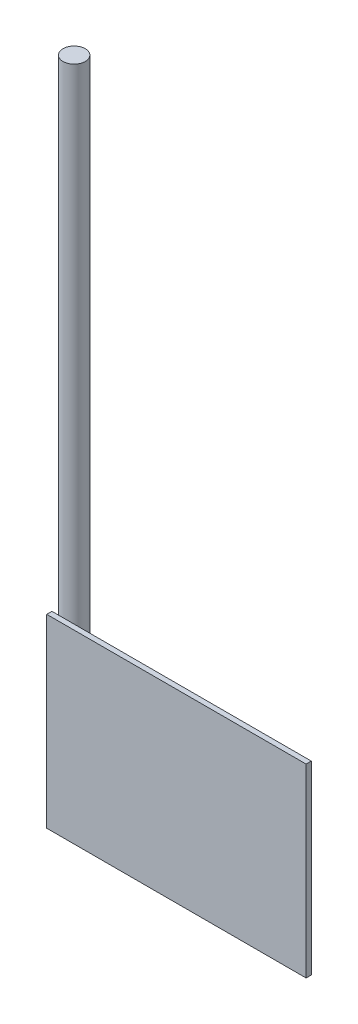
ISO-10303-21;
HEADER;
FILE_DESCRIPTION(('STEP AP214'),'2;1');
FILE_NAME('part.step','',(''),(''),'','','');
FILE_SCHEMA(('AUTOMOTIVE_DESIGN { 1 0 10303 214 1 1 1 1 }'));
ENDSEC;
DATA;
#1=APPLICATION_CONTEXT('core data for automotive mechanical design processes');
#2=APPLICATION_PROTOCOL_DEFINITION('international standard','automotive_design',2000,#1);
#3=PRODUCT_CONTEXT('',#1,'mechanical');
#4=PRODUCT('Part','Part','',(#3));
#5=PRODUCT_RELATED_PRODUCT_CATEGORY('part','',(#4));
#6=PRODUCT_DEFINITION_FORMATION('','',#4);
#7=PRODUCT_DEFINITION_CONTEXT('part definition',#1,'design');
#8=PRODUCT_DEFINITION('design','',#6,#7);
#9=PRODUCT_DEFINITION_SHAPE('','',#8);
#10=(LENGTH_UNIT() NAMED_UNIT(*) SI_UNIT(.MILLI.,.METRE.));
#11=(NAMED_UNIT(*) PLANE_ANGLE_UNIT() SI_UNIT($,.RADIAN.));
#12=(NAMED_UNIT(*) SI_UNIT($,.STERADIAN.) SOLID_ANGLE_UNIT());
#13=UNCERTAINTY_MEASURE_WITH_UNIT(LENGTH_MEASURE(1.E-05),#10,'distance_accuracy_value','');
#14=(GEOMETRIC_REPRESENTATION_CONTEXT(3) GLOBAL_UNCERTAINTY_ASSIGNED_CONTEXT((#13)) GLOBAL_UNIT_ASSIGNED_CONTEXT((#10,
#11,#12)) REPRESENTATION_CONTEXT('',''));
#15=CARTESIAN_POINT('',(0.,0.,0.));
#16=DIRECTION('',(0.,0.,1.));
#17=DIRECTION('',(1.,0.,0.));
#18=AXIS2_PLACEMENT_3D('',#15,#16,#17);
#19=CARTESIAN_POINT('',(-16.,77.5,-2.2));
#20=DIRECTION('',(0.,-1.,0.));
#21=DIRECTION('',(0.,0.,-1.));
#22=AXIS2_PLACEMENT_3D('',#19,#20,#21);
#23=CYLINDRICAL_SURFACE('',#22,1.5);
#24=CARTESIAN_POINT('',(-16.,77.5,-2.2));
#25=DIRECTION('',(0.,1.,0.));
#26=DIRECTION('',(0.,0.,1.));
#27=AXIS2_PLACEMENT_3D('',#24,#25,#26);
#28=CIRCLE('',#27,1.5);
#29=CARTESIAN_POINT('',(-16.,77.5,-3.7));
#30=VERTEX_POINT('',#29);
#31=EDGE_CURVE('E13',#30,#30,#28,.T.);
#32=CARTESIAN_POINT('',(-16.,-12.5,-2.2));
#33=DIRECTION('',(0.,1.,0.));
#34=DIRECTION('',(0.,0.,1.));
#35=AXIS2_PLACEMENT_3D('',#32,#33,#34);
#36=CIRCLE('',#35,1.5);
#37=CARTESIAN_POINT('',(-16.,-12.5,-3.7));
#38=VERTEX_POINT('',#37);
#39=EDGE_CURVE('E63',#38,#38,#36,.T.);
#40=CARTESIAN_POINT('',(-16.,77.5,-3.7));
#41=CARTESIAN_POINT('',(-16.,76.5625,-3.7));
#42=CARTESIAN_POINT('',(-16.,75.625,-3.7));
#43=CARTESIAN_POINT('',(-16.,73.75,-3.7));
#44=CARTESIAN_POINT('',(-16.,72.8125,-3.7));
#45=CARTESIAN_POINT('',(-16.,70.9375,-3.7));
#46=CARTESIAN_POINT('',(-16.,70.,-3.7));
#47=CARTESIAN_POINT('',(-16.,68.125,-3.7));
#48=CARTESIAN_POINT('',(-16.,67.1875,-3.7));
#49=CARTESIAN_POINT('',(-16.,65.3125,-3.7));
#50=CARTESIAN_POINT('',(-16.,64.375,-3.7));
#51=CARTESIAN_POINT('',(-16.,62.5,-3.7));
#52=CARTESIAN_POINT('',(-16.,61.5625,-3.7));
#53=CARTESIAN_POINT('',(-16.,59.6875,-3.7));
#54=CARTESIAN_POINT('',(-16.,58.75,-3.7));
#55=CARTESIAN_POINT('',(-16.,56.875,-3.7));
#56=CARTESIAN_POINT('',(-16.,55.9375,-3.7));
#57=CARTESIAN_POINT('',(-16.,54.0625,-3.7));
#58=CARTESIAN_POINT('',(-16.,53.125,-3.7));
#59=CARTESIAN_POINT('',(-16.,51.25,-3.7));
#60=CARTESIAN_POINT('',(-16.,50.3125,-3.7));
#61=CARTESIAN_POINT('',(-16.,48.4375,-3.7));
#62=CARTESIAN_POINT('',(-16.,47.5,-3.7));
#63=CARTESIAN_POINT('',(-16.,45.625,-3.7));
#64=CARTESIAN_POINT('',(-16.,44.6875,-3.7));
#65=CARTESIAN_POINT('',(-16.,42.8125,-3.7));
#66=CARTESIAN_POINT('',(-16.,41.875,-3.7));
#67=CARTESIAN_POINT('',(-16.,40.,-3.7));
#68=CARTESIAN_POINT('',(-16.,39.0625,-3.7));
#69=CARTESIAN_POINT('',(-16.,37.1875,-3.7));
#70=CARTESIAN_POINT('',(-16.,36.25,-3.7));
#71=CARTESIAN_POINT('',(-16.,34.375,-3.7));
#72=CARTESIAN_POINT('',(-16.,33.4375,-3.7));
#73=CARTESIAN_POINT('',(-16.,31.5625,-3.7));
#74=CARTESIAN_POINT('',(-16.,30.625,-3.7));
#75=CARTESIAN_POINT('',(-16.,28.75,-3.7));
#76=CARTESIAN_POINT('',(-16.,27.8125,-3.7));
#77=CARTESIAN_POINT('',(-16.,25.9375,-3.7));
#78=CARTESIAN_POINT('',(-16.,25.,-3.7));
#79=CARTESIAN_POINT('',(-16.,23.125,-3.7));
#80=CARTESIAN_POINT('',(-16.,22.1875,-3.7));
#81=CARTESIAN_POINT('',(-16.,20.3125,-3.7));
#82=CARTESIAN_POINT('',(-16.,19.375,-3.7));
#83=CARTESIAN_POINT('',(-16.,17.5,-3.7));
#84=CARTESIAN_POINT('',(-16.,16.5625,-3.7));
#85=CARTESIAN_POINT('',(-16.,14.6875,-3.7));
#86=CARTESIAN_POINT('',(-16.,13.75,-3.7));
#87=CARTESIAN_POINT('',(-16.,11.875,-3.7));
#88=CARTESIAN_POINT('',(-16.,10.9375,-3.7));
#89=CARTESIAN_POINT('',(-16.,9.0625,-3.7));
#90=CARTESIAN_POINT('',(-16.,8.125,-3.7));
#91=CARTESIAN_POINT('',(-16.,6.25,-3.7));
#92=CARTESIAN_POINT('',(-16.,5.31249999999999,-3.7));
#93=CARTESIAN_POINT('',(-16.,3.43749999999999,-3.7));
#94=CARTESIAN_POINT('',(-16.,2.49999999999999,-3.7));
#95=CARTESIAN_POINT('',(-16.,0.624999999999996,-3.7));
#96=CARTESIAN_POINT('',(-16.,-0.312500000000003,-3.7));
#97=CARTESIAN_POINT('',(-16.,-2.1875,-3.7));
#98=CARTESIAN_POINT('',(-16.,-3.12500000000001,-3.7));
#99=CARTESIAN_POINT('',(-16.,-5.00000000000001,-3.7));
#100=CARTESIAN_POINT('',(-16.,-5.93750000000001,-3.7));
#101=CARTESIAN_POINT('',(-16.,-7.81250000000001,-3.7));
#102=CARTESIAN_POINT('',(-16.,-8.75000000000001,-3.7));
#103=CARTESIAN_POINT('',(-16.,-10.625,-3.7));
#104=CARTESIAN_POINT('',(-16.,-11.5625,-3.7));
#105=CARTESIAN_POINT('',(-16.,-12.5,-3.7));
#106=B_SPLINE_CURVE_WITH_KNOTS('',3,(#40,#41,#42,#43,#44,#45,#46,#47,#48,#49,#50,#51,#52,#53,
#54,#55,#56,#57,#58,#59,#60,#61,#62,#63,#64,#65,#66,#67,#68,#69,#70,#71,#72,#73,#74,#75,#76,#77,
#78,#79,#80,#81,#82,#83,#84,#85,#86,#87,#88,#89,#90,#91,#92,#93,#94,#95,#96,#97,#98,#99,#100,
#101,#102,#103,#104,#105),.UNSPECIFIED.,.F.,.F.,(4,2,2,2,2,2,2,2,2,2,2,2,2,2,2,2,2,2,2,2,2,2,2,
2,2,2,2,2,2,2,2,2,4),(0.,2.81250000000001,5.62500000000001,8.4375,11.25,14.0625,16.875,19.6875,
22.5,25.3125,28.125,30.9375,33.75,36.5625,39.375,42.1875,45.,47.8125,50.625,53.4375,56.25,
59.0625,61.875,64.6875,67.5,70.3125,73.125,75.9375,78.75,81.5625,84.375,87.1875,90.),.UNSPECIFIED.);
#107=EDGE_CURVE('BSEAM60',#30,#38,#106,.T.);
#108=ORIENTED_EDGE('',*,*,#31,.F.);
#109=ORIENTED_EDGE('',*,*,#39,.T.);
#110=ORIENTED_EDGE('',*,*,#107,.T.);
#111=ORIENTED_EDGE('',*,*,#107,.F.);
#112=EDGE_LOOP('',(#108,#110,#109,#111));
#113=FACE_BOUND('',#112,.T.);
#114=ADVANCED_FACE('F60',(#113),#23,.T.);
#115=CARTESIAN_POINT('',(-16.,77.5,-2.2));
#116=DIRECTION('',(0.,1.,0.));
#117=DIRECTION('',(0.,0.,1.));
#118=AXIS2_PLACEMENT_3D('',#115,#116,#117);
#119=PLANE('',#118);
#120=ORIENTED_EDGE('',*,*,#31,.T.);
#121=EDGE_LOOP('',(#120));
#122=FACE_BOUND('',#121,.T.);
#123=ADVANCED_FACE('F75',(#122),#119,.T.);
#124=CARTESIAN_POINT('',(-16.,-12.5,-2.2));
#125=DIRECTION('',(0.,1.,0.));
#126=DIRECTION('',(0.,0.,1.));
#127=AXIS2_PLACEMENT_3D('',#124,#125,#126);
#128=PLANE('',#127);
#129=ORIENTED_EDGE('',*,*,#39,.F.);
#130=EDGE_LOOP('',(#129));
#131=FACE_BOUND('',#130,.T.);
#132=ADVANCED_FACE('F73',(#131),#128,.F.);
#133=CLOSED_SHELL('',(#114,#123,#132));
#134=MANIFOLD_SOLID_BREP('B2',#133);
#135=CARTESIAN_POINT('',(17.5,12.5,-0.7));
#136=DIRECTION('',(1.,0.,0.));
#137=DIRECTION('',(0.,1.,0.));
#138=AXIS2_PLACEMENT_3D('',#135,#136,#137);
#139=PLANE('',#138);
#140=DIRECTION('',(0.,1.,0.));
#141=VECTOR('',#140,1.);
#142=CARTESIAN_POINT('',(17.5,12.5,0.));
#143=LINE('',#142,#141);
#144=CARTESIAN_POINT('',(17.5,-12.5,0.));
#145=VERTEX_POINT('',#144);
#146=CARTESIAN_POINT('',(17.5,12.5,0.));
#147=VERTEX_POINT('',#146);
#148=EDGE_CURVE('E164',#145,#147,#143,.T.);
#149=ORIENTED_EDGE('',*,*,#148,.F.);
#150=DIRECTION('',(0.,0.,1.));
#151=VECTOR('',#150,1.);
#152=CARTESIAN_POINT('',(17.5,-12.5,-0.7));
#153=LINE('',#152,#151);
#154=CARTESIAN_POINT('',(17.5,-12.5,-0.7));
#155=VERTEX_POINT('',#154);
#156=EDGE_CURVE('E58',#155,#145,#153,.T.);
#157=ORIENTED_EDGE('',*,*,#156,.F.);
#158=DIRECTION('',(0.,1.,0.));
#159=VECTOR('',#158,1.);
#160=CARTESIAN_POINT('',(17.5,12.5,-0.7));
#161=LINE('',#160,#159);
#162=CARTESIAN_POINT('',(17.5,12.5,-0.7));
#163=VERTEX_POINT('',#162);
#164=EDGE_CURVE('E158',#155,#163,#161,.T.);
#165=ORIENTED_EDGE('',*,*,#164,.T.);
#166=DIRECTION('',(0.,0.,1.));
#167=VECTOR('',#166,1.);
#168=CARTESIAN_POINT('',(17.5,12.5,-0.7));
#169=LINE('',#168,#167);
#170=EDGE_CURVE('E103',#163,#147,#169,.T.);
#171=ORIENTED_EDGE('',*,*,#170,.T.);
#172=EDGE_LOOP('',(#149,#157,#165,#171));
#173=FACE_BOUND('',#172,.T.);
#174=ADVANCED_FACE('F100',(#173),#139,.T.);
#175=CARTESIAN_POINT('',(-17.5,-12.5,-0.7));
#176=DIRECTION('',(0.,-1.,0.));
#177=DIRECTION('',(0.,0.,-1.));
#178=AXIS2_PLACEMENT_3D('',#175,#176,#177);
#179=PLANE('',#178);
#180=DIRECTION('',(1.,0.,0.));
#181=VECTOR('',#180,1.);
#182=CARTESIAN_POINT('',(-17.5,-12.5,0.));
#183=LINE('',#182,#181);
#184=CARTESIAN_POINT('',(-17.5,-12.5,0.));
#185=VERTEX_POINT('',#184);
#186=EDGE_CURVE('E160',#185,#145,#183,.T.);
#187=ORIENTED_EDGE('',*,*,#186,.F.);
#188=DIRECTION('',(0.,0.,1.));
#189=VECTOR('',#188,1.);
#190=CARTESIAN_POINT('',(-17.5,-12.5,-0.7));
#191=LINE('',#190,#189);
#192=CARTESIAN_POINT('',(-17.5,-12.5,-0.7));
#193=VERTEX_POINT('',#192);
#194=EDGE_CURVE('E109',#193,#185,#191,.T.);
#195=ORIENTED_EDGE('',*,*,#194,.F.);
#196=DIRECTION('',(1.,0.,0.));
#197=VECTOR('',#196,1.);
#198=CARTESIAN_POINT('',(-17.5,-12.5,-0.7));
#199=LINE('',#198,#197);
#200=EDGE_CURVE('E155',#193,#155,#199,.T.);
#201=ORIENTED_EDGE('',*,*,#200,.T.);
#202=ORIENTED_EDGE('',*,*,#156,.T.);
#203=EDGE_LOOP('',(#187,#195,#201,#202));
#204=FACE_BOUND('',#203,.T.);
#205=ADVANCED_FACE('F174',(#204),#179,.T.);
#206=CARTESIAN_POINT('',(-17.5,12.5,-0.7));
#207=DIRECTION('',(-1.,0.,0.));
#208=DIRECTION('',(0.,-1.,0.));
#209=AXIS2_PLACEMENT_3D('',#206,#207,#208);
#210=PLANE('',#209);
#211=DIRECTION('',(0.,-1.,0.));
#212=VECTOR('',#211,1.);
#213=CARTESIAN_POINT('',(-17.5,12.5,0.));
#214=LINE('',#213,#212);
#215=CARTESIAN_POINT('',(-17.5,12.5,0.));
#216=VERTEX_POINT('',#215);
#217=EDGE_CURVE('E150',#216,#185,#214,.T.);
#218=ORIENTED_EDGE('',*,*,#217,.F.);
#219=DIRECTION('',(0.,0.,1.));
#220=VECTOR('',#219,1.);
#221=CARTESIAN_POINT('',(-17.5,12.5,-0.7));
#222=LINE('',#221,#220);
#223=CARTESIAN_POINT('',(-17.5,12.5,-0.7));
#224=VERTEX_POINT('',#223);
#225=EDGE_CURVE('E145',#224,#216,#222,.T.);
#226=ORIENTED_EDGE('',*,*,#225,.F.);
#227=DIRECTION('',(0.,-1.,0.));
#228=VECTOR('',#227,1.);
#229=CARTESIAN_POINT('',(-17.5,12.5,-0.7));
#230=LINE('',#229,#228);
#231=EDGE_CURVE('E148',#224,#193,#230,.T.);
#232=ORIENTED_EDGE('',*,*,#231,.T.);
#233=ORIENTED_EDGE('',*,*,#194,.T.);
#234=EDGE_LOOP('',(#218,#226,#232,#233));
#235=FACE_BOUND('',#234,.T.);
#236=ADVANCED_FACE('F147',(#235),#210,.T.);
#237=CARTESIAN_POINT('',(-17.5,12.5,-0.7));
#238=DIRECTION('',(0.,1.,0.));
#239=DIRECTION('',(0.,0.,1.));
#240=AXIS2_PLACEMENT_3D('',#237,#238,#239);
#241=PLANE('',#240);
#242=DIRECTION('',(-1.,0.,0.));
#243=VECTOR('',#242,1.);
#244=CARTESIAN_POINT('',(-17.5,12.5,0.));
#245=LINE('',#244,#243);
#246=EDGE_CURVE('E167',#147,#216,#245,.T.);
#247=ORIENTED_EDGE('',*,*,#246,.F.);
#248=ORIENTED_EDGE('',*,*,#170,.F.);
#249=DIRECTION('',(-1.,0.,0.));
#250=VECTOR('',#249,1.);
#251=CARTESIAN_POINT('',(-17.5,12.5,-0.7));
#252=LINE('',#251,#250);
#253=EDGE_CURVE('E154',#163,#224,#252,.T.);
#254=ORIENTED_EDGE('',*,*,#253,.T.);
#255=ORIENTED_EDGE('',*,*,#225,.T.);
#256=EDGE_LOOP('',(#247,#248,#254,#255));
#257=FACE_BOUND('',#256,.T.);
#258=ADVANCED_FACE('F157',(#257),#241,.T.);
#259=CARTESIAN_POINT('',(0.,0.,-0.7));
#260=DIRECTION('',(0.,0.,1.));
#261=DIRECTION('',(1.,0.,0.));
#262=AXIS2_PLACEMENT_3D('',#259,#260,#261);
#263=PLANE('',#262);
#264=ORIENTED_EDGE('',*,*,#164,.F.);
#265=ORIENTED_EDGE('',*,*,#200,.F.);
#266=ORIENTED_EDGE('',*,*,#231,.F.);
#267=ORIENTED_EDGE('',*,*,#253,.F.);
#268=EDGE_LOOP('',(#264,#265,#266,#267));
#269=FACE_BOUND('',#268,.T.);
#270=ADVANCED_FACE('F153',(#269),#263,.F.);
#271=CARTESIAN_POINT('',(0.,0.,0.));
#272=DIRECTION('',(0.,0.,1.));
#273=DIRECTION('',(1.,0.,0.));
#274=AXIS2_PLACEMENT_3D('',#271,#272,#273);
#275=PLANE('',#274);
#276=ORIENTED_EDGE('',*,*,#148,.T.);
#277=ORIENTED_EDGE('',*,*,#246,.T.);
#278=ORIENTED_EDGE('',*,*,#217,.T.);
#279=ORIENTED_EDGE('',*,*,#186,.T.);
#280=EDGE_LOOP('',(#276,#277,#278,#279));
#281=FACE_BOUND('',#280,.T.);
#282=ADVANCED_FACE('F173',(#281),#275,.T.);
#283=CLOSED_SHELL('',(#174,#205,#236,#258,#270,#282));
#284=MANIFOLD_SOLID_BREP('B8',#283);
#285=ADVANCED_BREP_SHAPE_REPRESENTATION('',(#18,#134,#284),#14);
#286=SHAPE_DEFINITION_REPRESENTATION(#9,#285);
ENDSEC;
END-ISO-10303-21;
